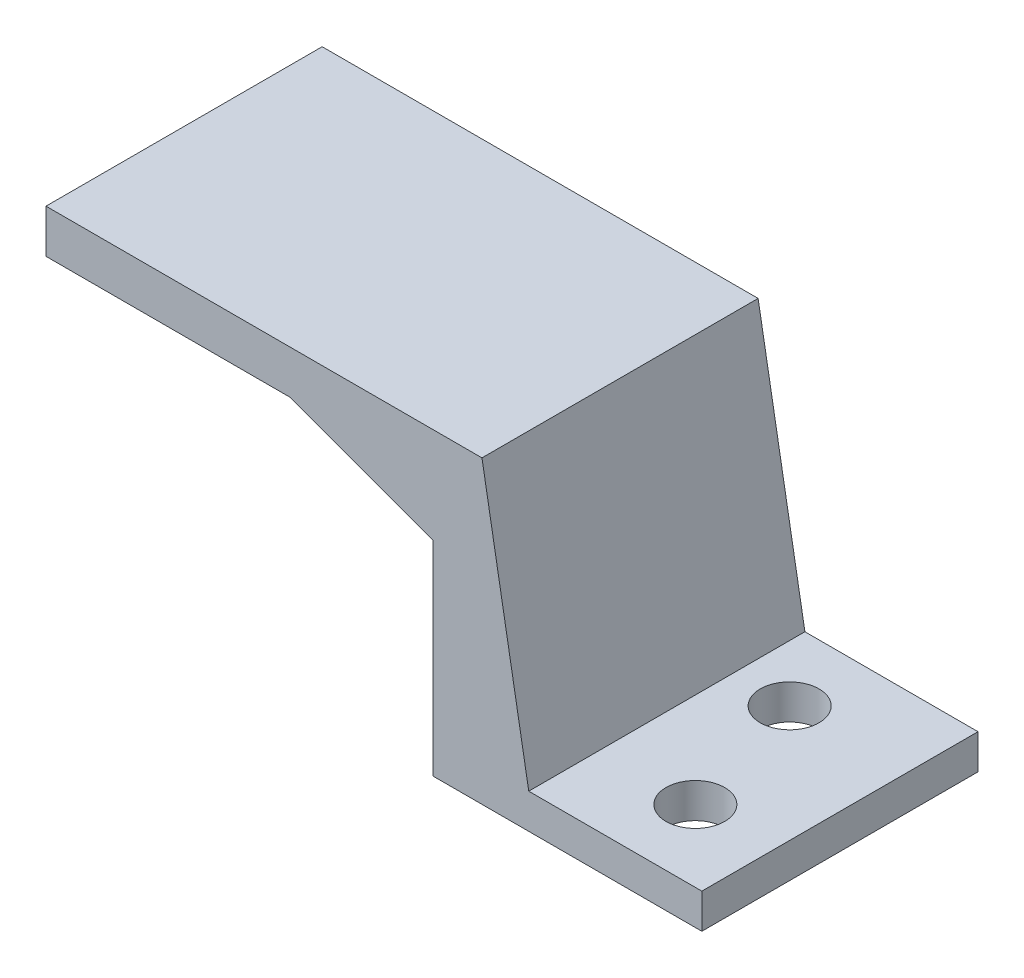
ISO-10303-21;
HEADER;
FILE_DESCRIPTION(('STEP AP214'),'2;1');
FILE_NAME('part.step','',(''),(''),'','','');
FILE_SCHEMA(('AUTOMOTIVE_DESIGN { 1 0 10303 214 1 1 1 1 }'));
ENDSEC;
DATA;
#1=APPLICATION_CONTEXT('core data for automotive mechanical design processes');
#2=APPLICATION_PROTOCOL_DEFINITION('international standard','automotive_design',2000,#1);
#3=PRODUCT_CONTEXT('',#1,'mechanical');
#4=PRODUCT('Part','Part','',(#3));
#5=PRODUCT_RELATED_PRODUCT_CATEGORY('part','',(#4));
#6=PRODUCT_DEFINITION_FORMATION('','',#4);
#7=PRODUCT_DEFINITION_CONTEXT('part definition',#1,'design');
#8=PRODUCT_DEFINITION('design','',#6,#7);
#9=PRODUCT_DEFINITION_SHAPE('','',#8);
#10=(LENGTH_UNIT() NAMED_UNIT(*) SI_UNIT(.MILLI.,.METRE.));
#11=(NAMED_UNIT(*) PLANE_ANGLE_UNIT() SI_UNIT($,.RADIAN.));
#12=(NAMED_UNIT(*) SI_UNIT($,.STERADIAN.) SOLID_ANGLE_UNIT());
#13=UNCERTAINTY_MEASURE_WITH_UNIT(LENGTH_MEASURE(1.E-05),#10,'distance_accuracy_value','');
#14=(GEOMETRIC_REPRESENTATION_CONTEXT(3) GLOBAL_UNCERTAINTY_ASSIGNED_CONTEXT((#13)) GLOBAL_UNIT_ASSIGNED_CONTEXT((#10,
#11,#12)) REPRESENTATION_CONTEXT('',''));
#15=CARTESIAN_POINT('',(0.,0.,0.));
#16=DIRECTION('',(0.,0.,1.));
#17=DIRECTION('',(1.,0.,0.));
#18=AXIS2_PLACEMENT_3D('',#15,#16,#17);
#19=CARTESIAN_POINT('',(0.,0.,31.75));
#20=DIRECTION('',(0.,-1.,0.));
#21=DIRECTION('',(1.,0.,0.));
#22=AXIS2_PLACEMENT_3D('',#19,#20,#21);
#23=PLANE('',#22);
#24=CARTESIAN_POINT('',(21.9,0.,23.495));
#25=DIRECTION('',(0.,1.,0.));
#26=DIRECTION('',(0.,0.,1.));
#27=AXIS2_PLACEMENT_3D('',#24,#25,#26);
#28=CIRCLE('',#27,3.3782);
#29=CARTESIAN_POINT('',(21.9,0.,26.8732));
#30=VERTEX_POINT('',#29);
#31=EDGE_CURVE('E254',#30,#30,#28,.T.);
#32=ORIENTED_EDGE('',*,*,#31,.T.);
#33=EDGE_LOOP('',(#32));
#34=FACE_BOUND('',#33,.T.);
#35=CARTESIAN_POINT('',(17.5,0.,8.255));
#36=DIRECTION('',(0.,1.,0.));
#37=DIRECTION('',(0.,0.,1.));
#38=AXIS2_PLACEMENT_3D('',#35,#36,#37);
#39=CIRCLE('',#38,3.3782);
#40=CARTESIAN_POINT('',(17.5,0.,11.6332));
#41=VERTEX_POINT('',#40);
#42=EDGE_CURVE('E152',#41,#41,#39,.T.);
#43=ORIENTED_EDGE('',*,*,#42,.T.);
#44=EDGE_LOOP('',(#43));
#45=FACE_BOUND('',#44,.T.);
#46=DIRECTION('',(-1.,0.,0.));
#47=VECTOR('',#46,1.);
#48=CARTESIAN_POINT('',(0.,0.,0.));
#49=LINE('',#48,#47);
#50=CARTESIAN_POINT('',(30.9,0.,0.));
#51=VERTEX_POINT('',#50);
#52=CARTESIAN_POINT('',(0.,0.,0.));
#53=VERTEX_POINT('',#52);
#54=EDGE_CURVE('E116',#51,#53,#49,.T.);
#55=ORIENTED_EDGE('',*,*,#54,.F.);
#56=DIRECTION('',(0.,0.,-1.));
#57=VECTOR('',#56,1.);
#58=CARTESIAN_POINT('',(30.9,0.,31.75));
#59=LINE('',#58,#57);
#60=CARTESIAN_POINT('',(30.9,0.,31.75));
#61=VERTEX_POINT('',#60);
#62=EDGE_CURVE('E111',#61,#51,#59,.T.);
#63=ORIENTED_EDGE('',*,*,#62,.F.);
#64=DIRECTION('',(-1.,0.,0.));
#65=VECTOR('',#64,1.);
#66=CARTESIAN_POINT('',(0.,0.,31.75));
#67=LINE('',#66,#65);
#68=CARTESIAN_POINT('',(0.,0.,31.75));
#69=VERTEX_POINT('',#68);
#70=EDGE_CURVE('E113',#61,#69,#67,.T.);
#71=ORIENTED_EDGE('',*,*,#70,.T.);
#72=DIRECTION('',(0.,0.,-1.));
#73=VECTOR('',#72,1.);
#74=CARTESIAN_POINT('',(0.,0.,31.75));
#75=LINE('',#74,#73);
#76=EDGE_CURVE('E149',#69,#53,#75,.T.);
#77=ORIENTED_EDGE('',*,*,#76,.T.);
#78=EDGE_LOOP('',(#55,#63,#71,#77));
#79=FACE_BOUND('',#78,.T.);
#80=ADVANCED_FACE('F41',(#34,#45,#79),#23,.T.);
#81=CARTESIAN_POINT('',(30.9,0.,31.75));
#82=DIRECTION('',(1.,0.,0.));
#83=DIRECTION('',(0.,1.,0.));
#84=AXIS2_PLACEMENT_3D('',#81,#82,#83);
#85=PLANE('',#84);
#86=DIRECTION('',(0.,-1.,0.));
#87=VECTOR('',#86,1.);
#88=CARTESIAN_POINT('',(30.9,0.,0.));
#89=LINE('',#88,#87);
#90=CARTESIAN_POINT('',(30.9,4.,0.));
#91=VERTEX_POINT('',#90);
#92=EDGE_CURVE('E151',#91,#51,#89,.T.);
#93=ORIENTED_EDGE('',*,*,#92,.F.);
#94=DIRECTION('',(0.,0.,-1.));
#95=VECTOR('',#94,1.);
#96=CARTESIAN_POINT('',(30.9,4.,31.75));
#97=LINE('',#96,#95);
#98=CARTESIAN_POINT('',(30.9,4.,31.75));
#99=VERTEX_POINT('',#98);
#100=EDGE_CURVE('E122',#99,#91,#97,.T.);
#101=ORIENTED_EDGE('',*,*,#100,.F.);
#102=DIRECTION('',(0.,-1.,0.));
#103=VECTOR('',#102,1.);
#104=CARTESIAN_POINT('',(30.9,0.,31.75));
#105=LINE('',#104,#103);
#106=EDGE_CURVE('E128',#99,#61,#105,.T.);
#107=ORIENTED_EDGE('',*,*,#106,.T.);
#108=ORIENTED_EDGE('',*,*,#62,.T.);
#109=EDGE_LOOP('',(#93,#101,#107,#108));
#110=FACE_BOUND('',#109,.T.);
#111=ADVANCED_FACE('F134',(#110),#85,.T.);
#112=CARTESIAN_POINT('',(0.,4.,31.75));
#113=DIRECTION('',(0.,1.,0.));
#114=DIRECTION('',(-1.,0.,0.));
#115=AXIS2_PLACEMENT_3D('',#112,#113,#114);
#116=PLANE('',#115);
#117=CARTESIAN_POINT('',(21.9,4.,23.495));
#118=DIRECTION('',(0.,1.,0.));
#119=DIRECTION('',(0.,0.,1.));
#120=AXIS2_PLACEMENT_3D('',#117,#118,#119);
#121=CIRCLE('',#120,3.37819999999999);
#122=CARTESIAN_POINT('',(21.9,4.,26.8732));
#123=VERTEX_POINT('',#122);
#124=EDGE_CURVE('E257',#123,#123,#121,.T.);
#125=ORIENTED_EDGE('',*,*,#124,.F.);
#126=EDGE_LOOP('',(#125));
#127=FACE_BOUND('',#126,.T.);
#128=CARTESIAN_POINT('',(17.5,4.,8.255));
#129=DIRECTION('',(0.,1.,0.));
#130=DIRECTION('',(0.,0.,1.));
#131=AXIS2_PLACEMENT_3D('',#128,#129,#130);
#132=CIRCLE('',#131,3.37819999999999);
#133=CARTESIAN_POINT('',(17.5,4.,11.6332));
#134=VERTEX_POINT('',#133);
#135=EDGE_CURVE('E259',#134,#134,#132,.T.);
#136=ORIENTED_EDGE('',*,*,#135,.F.);
#137=EDGE_LOOP('',(#136));
#138=FACE_BOUND('',#137,.T.);
#139=DIRECTION('',(1.,0.,0.));
#140=VECTOR('',#139,1.);
#141=CARTESIAN_POINT('',(0.,4.,0.));
#142=LINE('',#141,#140);
#143=CARTESIAN_POINT('',(11.0000000000002,4.,0.));
#144=VERTEX_POINT('',#143);
#145=EDGE_CURVE('E154',#144,#91,#142,.T.);
#146=ORIENTED_EDGE('',*,*,#145,.F.);
#147=DIRECTION('',(0.,0.,1.));
#148=VECTOR('',#147,1.);
#149=CARTESIAN_POINT('',(11.0000000000002,4.,31.75));
#150=LINE('',#149,#148);
#151=CARTESIAN_POINT('',(11.0000000000002,4.,31.75));
#152=VERTEX_POINT('',#151);
#153=EDGE_CURVE('E121',#144,#152,#150,.T.);
#154=ORIENTED_EDGE('',*,*,#153,.T.);
#155=DIRECTION('',(1.,0.,0.));
#156=VECTOR('',#155,1.);
#157=CARTESIAN_POINT('',(0.,4.,31.75));
#158=LINE('',#157,#156);
#159=EDGE_CURVE('E136',#152,#99,#158,.T.);
#160=ORIENTED_EDGE('',*,*,#159,.T.);
#161=ORIENTED_EDGE('',*,*,#100,.T.);
#162=EDGE_LOOP('',(#146,#154,#160,#161));
#163=FACE_BOUND('',#162,.T.);
#164=ADVANCED_FACE('F196',(#127,#138,#163),#116,.T.);
#165=CARTESIAN_POINT('',(0.,34.5,31.75));
#166=DIRECTION('',(0.,-1.,0.));
#167=DIRECTION('',(1.,0.,0.));
#168=AXIS2_PLACEMENT_3D('',#165,#166,#167);
#169=PLANE('',#168);
#170=DIRECTION('',(-1.,0.,0.));
#171=VECTOR('',#170,1.);
#172=CARTESIAN_POINT('',(0.,34.5,0.));
#173=LINE('',#172,#171);
#174=CARTESIAN_POINT('',(5.62202708839213,34.5,0.));
#175=VERTEX_POINT('',#174);
#176=CARTESIAN_POINT('',(-44.5,34.5,0.));
#177=VERTEX_POINT('',#176);
#178=EDGE_CURVE('E156',#175,#177,#173,.T.);
#179=ORIENTED_EDGE('',*,*,#178,.T.);
#180=DIRECTION('',(0.,0.,-1.));
#181=VECTOR('',#180,1.);
#182=CARTESIAN_POINT('',(-44.5,34.5,31.75));
#183=LINE('',#182,#181);
#184=CARTESIAN_POINT('',(-44.5,34.5,31.75));
#185=VERTEX_POINT('',#184);
#186=EDGE_CURVE('E169',#185,#177,#183,.T.);
#187=ORIENTED_EDGE('',*,*,#186,.F.);
#188=DIRECTION('',(-1.,0.,0.));
#189=VECTOR('',#188,1.);
#190=CARTESIAN_POINT('',(0.,34.5,31.75));
#191=LINE('',#190,#189);
#192=CARTESIAN_POINT('',(5.62202708839213,34.5,31.75));
#193=VERTEX_POINT('',#192);
#194=EDGE_CURVE('E138',#193,#185,#191,.T.);
#195=ORIENTED_EDGE('',*,*,#194,.F.);
#196=DIRECTION('',(0.,0.,1.));
#197=VECTOR('',#196,1.);
#198=CARTESIAN_POINT('',(5.62202708839213,34.5,31.75));
#199=LINE('',#198,#197);
#200=EDGE_CURVE('E174',#193,#175,#199,.F.);
#201=ORIENTED_EDGE('',*,*,#200,.T.);
#202=EDGE_LOOP('',(#179,#187,#195,#201));
#203=FACE_BOUND('',#202,.T.);
#204=ADVANCED_FACE('F203',(#203),#169,.F.);
#205=CARTESIAN_POINT('',(-44.5,0.,31.75));
#206=DIRECTION('',(-1.,0.,0.));
#207=DIRECTION('',(0.,0.,1.));
#208=AXIS2_PLACEMENT_3D('',#205,#206,#207);
#209=PLANE('',#208);
#210=DIRECTION('',(0.,1.,0.));
#211=VECTOR('',#210,1.);
#212=CARTESIAN_POINT('',(-44.5,0.,0.));
#213=LINE('',#212,#211);
#214=CARTESIAN_POINT('',(-44.5,29.5,0.));
#215=VERTEX_POINT('',#214);
#216=EDGE_CURVE('E159',#215,#177,#213,.T.);
#217=ORIENTED_EDGE('',*,*,#216,.F.);
#218=DIRECTION('',(0.,0.,-1.));
#219=VECTOR('',#218,1.);
#220=CARTESIAN_POINT('',(-44.5,29.5,31.75));
#221=LINE('',#220,#219);
#222=CARTESIAN_POINT('',(-44.5,29.5,31.75));
#223=VERTEX_POINT('',#222);
#224=EDGE_CURVE('E166',#223,#215,#221,.T.);
#225=ORIENTED_EDGE('',*,*,#224,.F.);
#226=DIRECTION('',(0.,1.,0.));
#227=VECTOR('',#226,1.);
#228=CARTESIAN_POINT('',(-44.5,0.,31.75));
#229=LINE('',#228,#227);
#230=EDGE_CURVE('E143',#223,#185,#229,.T.);
#231=ORIENTED_EDGE('',*,*,#230,.T.);
#232=ORIENTED_EDGE('',*,*,#186,.T.);
#233=EDGE_LOOP('',(#217,#225,#231,#232));
#234=FACE_BOUND('',#233,.T.);
#235=ADVANCED_FACE('F207',(#234),#209,.T.);
#236=CARTESIAN_POINT('',(0.,29.5,31.75));
#237=DIRECTION('',(0.,-1.,0.));
#238=DIRECTION('',(1.,0.,0.));
#239=AXIS2_PLACEMENT_3D('',#236,#237,#238);
#240=PLANE('',#239);
#241=DIRECTION('',(-1.,0.,0.));
#242=VECTOR('',#241,1.);
#243=CARTESIAN_POINT('',(0.,29.5,0.));
#244=LINE('',#243,#242);
#245=CARTESIAN_POINT('',(-16.4848645167281,29.5,0.));
#246=VERTEX_POINT('',#245);
#247=EDGE_CURVE('E162',#246,#215,#244,.T.);
#248=ORIENTED_EDGE('',*,*,#247,.F.);
#249=DIRECTION('',(0.,0.,1.));
#250=VECTOR('',#249,1.);
#251=CARTESIAN_POINT('',(-16.4848645167281,29.5,31.75));
#252=LINE('',#251,#250);
#253=CARTESIAN_POINT('',(-16.4848645167281,29.5,31.75));
#254=VERTEX_POINT('',#253);
#255=EDGE_CURVE('E57',#246,#254,#252,.T.);
#256=ORIENTED_EDGE('',*,*,#255,.T.);
#257=DIRECTION('',(-1.,0.,0.));
#258=VECTOR('',#257,1.);
#259=CARTESIAN_POINT('',(0.,29.5,31.75));
#260=LINE('',#259,#258);
#261=EDGE_CURVE('E146',#254,#223,#260,.T.);
#262=ORIENTED_EDGE('',*,*,#261,.T.);
#263=ORIENTED_EDGE('',*,*,#224,.T.);
#264=EDGE_LOOP('',(#248,#256,#262,#263));
#265=FACE_BOUND('',#264,.T.);
#266=ADVANCED_FACE('F235',(#265),#240,.T.);
#267=CARTESIAN_POINT('',(0.,0.,31.75));
#268=DIRECTION('',(-1.,0.,0.));
#269=DIRECTION('',(0.,-1.,0.));
#270=AXIS2_PLACEMENT_3D('',#267,#268,#269);
#271=PLANE('',#270);
#272=DIRECTION('',(0.,1.,0.));
#273=VECTOR('',#272,1.);
#274=CARTESIAN_POINT('',(0.,0.,31.75));
#275=LINE('',#274,#273);
#276=CARTESIAN_POINT('',(0.,23.5,31.75));
#277=VERTEX_POINT('',#276);
#278=EDGE_CURVE('E130',#69,#277,#275,.T.);
#279=ORIENTED_EDGE('',*,*,#278,.T.);
#280=DIRECTION('',(0.,0.,-1.));
#281=VECTOR('',#280,1.);
#282=CARTESIAN_POINT('',(0.,23.5,0.));
#283=LINE('',#282,#281);
#284=CARTESIAN_POINT('',(0.,23.5,0.));
#285=VERTEX_POINT('',#284);
#286=EDGE_CURVE('E182',#277,#285,#283,.T.);
#287=ORIENTED_EDGE('',*,*,#286,.T.);
#288=DIRECTION('',(0.,1.,0.));
#289=VECTOR('',#288,1.);
#290=CARTESIAN_POINT('',(0.,0.,0.));
#291=LINE('',#290,#289);
#292=EDGE_CURVE('E131',#53,#285,#291,.T.);
#293=ORIENTED_EDGE('',*,*,#292,.F.);
#294=ORIENTED_EDGE('',*,*,#76,.F.);
#295=EDGE_LOOP('',(#279,#287,#293,#294));
#296=FACE_BOUND('',#295,.T.);
#297=ADVANCED_FACE('F188',(#296),#271,.T.);
#298=CARTESIAN_POINT('',(0.,0.,31.75));
#299=DIRECTION('',(0.,0.,1.));
#300=DIRECTION('',(1.,0.,0.));
#301=AXIS2_PLACEMENT_3D('',#298,#299,#300);
#302=PLANE('',#301);
#303=ORIENTED_EDGE('',*,*,#70,.F.);
#304=ORIENTED_EDGE('',*,*,#106,.F.);
#305=ORIENTED_EDGE('',*,*,#159,.F.);
#306=DIRECTION('',(0.173648177666927,-0.984807753012209,0.));
#307=VECTOR('',#306,1.);
#308=CARTESIAN_POINT('',(5.49999999999999,35.1920500078992,31.75));
#309=LINE('',#308,#307);
#310=EDGE_CURVE('E179',#152,#193,#309,.F.);
#311=ORIENTED_EDGE('',*,*,#310,.T.);
#312=ORIENTED_EDGE('',*,*,#194,.T.);
#313=ORIENTED_EDGE('',*,*,#230,.F.);
#314=ORIENTED_EDGE('',*,*,#261,.F.);
#315=DIRECTION('',(-0.939692620785911,0.342020143325662,0.));
#316=VECTOR('',#315,1.);
#317=CARTESIAN_POINT('',(0.,23.5,31.75));
#318=LINE('',#317,#316);
#319=EDGE_CURVE('E11',#254,#277,#318,.F.);
#320=ORIENTED_EDGE('',*,*,#319,.T.);
#321=ORIENTED_EDGE('',*,*,#278,.F.);
#322=EDGE_LOOP('',(#303,#304,#305,#311,#312,#313,#314,#320,#321));
#323=FACE_BOUND('',#322,.T.);
#324=ADVANCED_FACE('F126',(#323),#302,.T.);
#325=CARTESIAN_POINT('',(0.,0.,0.));
#326=DIRECTION('',(0.,0.,1.));
#327=DIRECTION('',(1.,0.,0.));
#328=AXIS2_PLACEMENT_3D('',#325,#326,#327);
#329=PLANE('',#328);
#330=ORIENTED_EDGE('',*,*,#54,.T.);
#331=ORIENTED_EDGE('',*,*,#292,.T.);
#332=DIRECTION('',(0.939692620785911,-0.342020143325662,0.));
#333=VECTOR('',#332,1.);
#334=CARTESIAN_POINT('',(7.55275441381672,20.7510222066481,0.));
#335=LINE('',#334,#333);
#336=EDGE_CURVE('E50',#285,#246,#335,.F.);
#337=ORIENTED_EDGE('',*,*,#336,.T.);
#338=ORIENTED_EDGE('',*,*,#247,.T.);
#339=ORIENTED_EDGE('',*,*,#216,.T.);
#340=ORIENTED_EDGE('',*,*,#178,.F.);
#341=DIRECTION('',(-0.173648177666927,0.984807753012209,0.));
#342=VECTOR('',#341,1.);
#343=CARTESIAN_POINT('',(11.352349700974,2.00172554671936,0.));
#344=LINE('',#343,#342);
#345=EDGE_CURVE('E177',#175,#144,#344,.F.);
#346=ORIENTED_EDGE('',*,*,#345,.T.);
#347=ORIENTED_EDGE('',*,*,#145,.T.);
#348=ORIENTED_EDGE('',*,*,#92,.T.);
#349=EDGE_LOOP('',(#330,#331,#337,#338,#339,#340,#346,#347,#348));
#350=FACE_BOUND('',#349,.T.);
#351=ADVANCED_FACE('F191',(#350),#329,.F.);
#352=CARTESIAN_POINT('',(17.5,4.,8.255));
#353=DIRECTION('',(0.,1.,0.));
#354=DIRECTION('',(0.,0.,1.));
#355=AXIS2_PLACEMENT_3D('',#352,#353,#354);
#356=CYLINDRICAL_SURFACE('',#355,3.37819999999999);
#357=ORIENTED_EDGE('',*,*,#42,.F.);
#358=EDGE_LOOP('',(#357));
#359=FACE_BOUND('',#358,.T.);
#360=ORIENTED_EDGE('',*,*,#135,.T.);
#361=EDGE_LOOP('',(#360));
#362=FACE_BOUND('',#361,.T.);
#363=ADVANCED_FACE('F242',(#359,#362),#356,.F.);
#364=CARTESIAN_POINT('',(21.9,4.,23.495));
#365=DIRECTION('',(0.,1.,0.));
#366=DIRECTION('',(0.,0.,1.));
#367=AXIS2_PLACEMENT_3D('',#364,#365,#366);
#368=CYLINDRICAL_SURFACE('',#367,3.37819999999999);
#369=ORIENTED_EDGE('',*,*,#31,.F.);
#370=EDGE_LOOP('',(#369));
#371=FACE_BOUND('',#370,.T.);
#372=ORIENTED_EDGE('',*,*,#124,.T.);
#373=EDGE_LOOP('',(#372));
#374=FACE_BOUND('',#373,.T.);
#375=ADVANCED_FACE('F212',(#371,#374),#368,.F.);
#376=CARTESIAN_POINT('',(5.49999999999999,35.1920500078992,31.75));
#377=DIRECTION('',(0.984807753012208,0.173648177666927,0.));
#378=DIRECTION('',(0.,0.,1.));
#379=AXIS2_PLACEMENT_3D('',#376,#377,#378);
#380=PLANE('',#379);
#381=ORIENTED_EDGE('',*,*,#310,.F.);
#382=ORIENTED_EDGE('',*,*,#153,.F.);
#383=ORIENTED_EDGE('',*,*,#345,.F.);
#384=ORIENTED_EDGE('',*,*,#200,.F.);
#385=EDGE_LOOP('',(#381,#382,#383,#384));
#386=FACE_BOUND('',#385,.T.);
#387=ADVANCED_FACE('F201',(#386),#380,.T.);
#388=CARTESIAN_POINT('',(0.,23.5,31.75));
#389=DIRECTION('',(-0.342020143325662,-0.939692620785911,0.));
#390=DIRECTION('',(0.,0.,1.));
#391=AXIS2_PLACEMENT_3D('',#388,#389,#390);
#392=PLANE('',#391);
#393=ORIENTED_EDGE('',*,*,#319,.F.);
#394=ORIENTED_EDGE('',*,*,#255,.F.);
#395=ORIENTED_EDGE('',*,*,#336,.F.);
#396=ORIENTED_EDGE('',*,*,#286,.F.);
#397=EDGE_LOOP('',(#393,#394,#395,#396));
#398=FACE_BOUND('',#397,.T.);
#399=ADVANCED_FACE('F44',(#398),#392,.T.);
#400=CLOSED_SHELL('',(#80,#111,#164,#204,#235,#266,#297,#324,#351,#363,#375,#387,#399));
#401=MANIFOLD_SOLID_BREP('B2',#400);
#402=ADVANCED_BREP_SHAPE_REPRESENTATION('',(#18,#401),#14);
#403=SHAPE_DEFINITION_REPRESENTATION(#9,#402);
ENDSEC;
END-ISO-10303-21;
